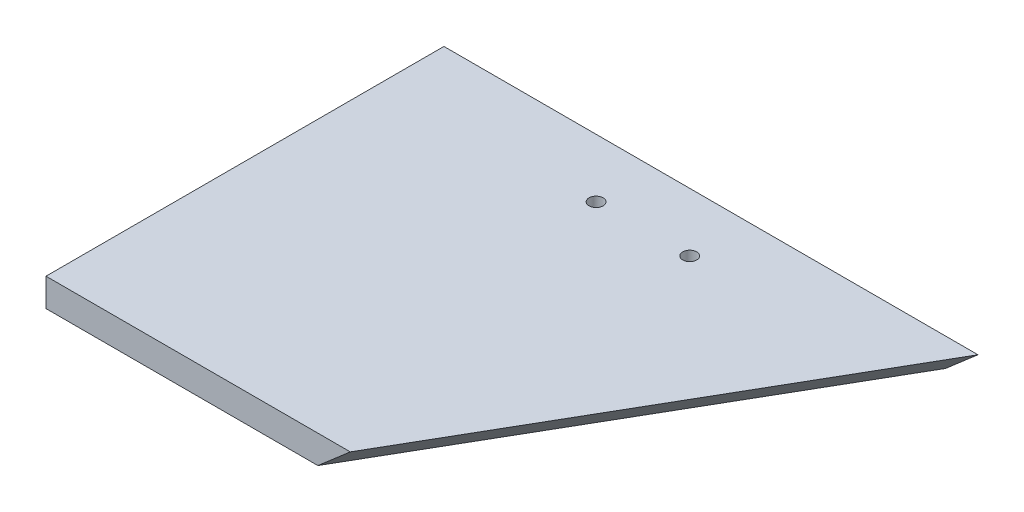
ISO-10303-21;
HEADER;
FILE_DESCRIPTION(('STEP AP214'),'2;1');
FILE_NAME('part.step','',(''),(''),'','','');
FILE_SCHEMA(('AUTOMOTIVE_DESIGN { 1 0 10303 214 1 1 1 1 }'));
ENDSEC;
DATA;
#1=APPLICATION_CONTEXT('core data for automotive mechanical design processes');
#2=APPLICATION_PROTOCOL_DEFINITION('international standard','automotive_design',2000,#1);
#3=PRODUCT_CONTEXT('',#1,'mechanical');
#4=PRODUCT('Part','Part','',(#3));
#5=PRODUCT_RELATED_PRODUCT_CATEGORY('part','',(#4));
#6=PRODUCT_DEFINITION_FORMATION('','',#4);
#7=PRODUCT_DEFINITION_CONTEXT('part definition',#1,'design');
#8=PRODUCT_DEFINITION('design','',#6,#7);
#9=PRODUCT_DEFINITION_SHAPE('','',#8);
#10=(LENGTH_UNIT() NAMED_UNIT(*) SI_UNIT(.MILLI.,.METRE.));
#11=(NAMED_UNIT(*) PLANE_ANGLE_UNIT() SI_UNIT($,.RADIAN.));
#12=(NAMED_UNIT(*) SI_UNIT($,.STERADIAN.) SOLID_ANGLE_UNIT());
#13=UNCERTAINTY_MEASURE_WITH_UNIT(LENGTH_MEASURE(1.E-05),#10,'distance_accuracy_value','');
#14=(GEOMETRIC_REPRESENTATION_CONTEXT(3) GLOBAL_UNCERTAINTY_ASSIGNED_CONTEXT((#13)) GLOBAL_UNIT_ASSIGNED_CONTEXT((#10,
#11,#12)) REPRESENTATION_CONTEXT('',''));
#15=CARTESIAN_POINT('',(0.,0.,0.));
#16=DIRECTION('',(0.,0.,1.));
#17=DIRECTION('',(1.,0.,0.));
#18=AXIS2_PLACEMENT_3D('',#15,#16,#17);
#19=CARTESIAN_POINT('',(0.,6.,0.));
#20=DIRECTION('',(0.,0.,-1.));
#21=DIRECTION('',(-1.,0.,0.));
#22=AXIS2_PLACEMENT_3D('',#19,#20,#21);
#23=PLANE('',#22);
#24=DIRECTION('',(1.,0.,0.));
#25=VECTOR('',#24,1.);
#26=CARTESIAN_POINT('',(0.,0.,0.));
#27=LINE('',#26,#25);
#28=CARTESIAN_POINT('',(-65.,0.,0.));
#29=VERTEX_POINT('',#28);
#30=CARTESIAN_POINT('',(-6.92820323027556,0.,0.));
#31=VERTEX_POINT('',#30);
#32=EDGE_CURVE('E94',#29,#31,#27,.T.);
#33=ORIENTED_EDGE('',*,*,#32,.T.);
#34=DIRECTION('',(0.755928946018456,0.654653670707976,0.));
#35=VECTOR('',#34,1.);
#36=CARTESIAN_POINT('',(0.,6.00000000000002,0.));
#37=LINE('',#36,#35);
#38=CARTESIAN_POINT('',(0.,6.,0.));
#39=VERTEX_POINT('',#38);
#40=EDGE_CURVE('E11',#31,#39,#37,.T.);
#41=ORIENTED_EDGE('',*,*,#40,.T.);
#42=DIRECTION('',(1.,0.,0.));
#43=VECTOR('',#42,1.);
#44=CARTESIAN_POINT('',(0.,6.,0.));
#45=LINE('',#44,#43);
#46=CARTESIAN_POINT('',(-65.,6.,0.));
#47=VERTEX_POINT('',#46);
#48=EDGE_CURVE('E93',#47,#39,#45,.T.);
#49=ORIENTED_EDGE('',*,*,#48,.F.);
#50=DIRECTION('',(0.,-1.,0.));
#51=VECTOR('',#50,1.);
#52=CARTESIAN_POINT('',(-65.,6.,0.));
#53=LINE('',#52,#51);
#54=EDGE_CURVE('E116',#47,#29,#53,.T.);
#55=ORIENTED_EDGE('',*,*,#54,.T.);
#56=EDGE_LOOP('',(#33,#41,#49,#55));
#57=FACE_BOUND('',#56,.T.);
#58=ADVANCED_FACE('F49',(#57),#23,.F.);
#59=CARTESIAN_POINT('',(0.,6.,-85.));
#60=DIRECTION('',(0.,0.,1.));
#61=DIRECTION('',(1.,0.,0.));
#62=AXIS2_PLACEMENT_3D('',#59,#60,#61);
#63=PLANE('',#62);
#64=DIRECTION('',(-1.,0.,0.));
#65=VECTOR('',#64,1.);
#66=CARTESIAN_POINT('',(49.0747728811187,6.,-85.));
#67=LINE('',#66,#65);
#68=CARTESIAN_POINT('',(49.0747728811187,6.,-85.));
#69=VERTEX_POINT('',#68);
#70=CARTESIAN_POINT('',(-65.,6.,-85.));
#71=VERTEX_POINT('',#70);
#72=EDGE_CURVE('E108',#69,#71,#67,.T.);
#73=ORIENTED_EDGE('',*,*,#72,.F.);
#74=DIRECTION('',(-0.755928946018456,-0.654653670707976,0.));
#75=VECTOR('',#74,1.);
#76=CARTESIAN_POINT('',(21.0320455204793,-18.2857142857145,-85.));
#77=LINE('',#76,#75);
#78=CARTESIAN_POINT('',(42.1465696508432,0.,-85.));
#79=VERTEX_POINT('',#78);
#80=EDGE_CURVE('E73',#69,#79,#77,.T.);
#81=ORIENTED_EDGE('',*,*,#80,.T.);
#82=DIRECTION('',(-1.,0.,0.));
#83=VECTOR('',#82,1.);
#84=CARTESIAN_POINT('',(0.,0.,-85.));
#85=LINE('',#84,#83);
#86=CARTESIAN_POINT('',(-65.,0.,-85.));
#87=VERTEX_POINT('',#86);
#88=EDGE_CURVE('E119',#79,#87,#85,.T.);
#89=ORIENTED_EDGE('',*,*,#88,.T.);
#90=DIRECTION('',(0.,-1.,0.));
#91=VECTOR('',#90,1.);
#92=CARTESIAN_POINT('',(-65.,6.,-85.));
#93=LINE('',#92,#91);
#94=EDGE_CURVE('E127',#71,#87,#93,.T.);
#95=ORIENTED_EDGE('',*,*,#94,.F.);
#96=EDGE_LOOP('',(#73,#81,#89,#95));
#97=FACE_BOUND('',#96,.T.);
#98=ADVANCED_FACE('F138',(#97),#63,.F.);
#99=CARTESIAN_POINT('',(-65.,6.,0.));
#100=DIRECTION('',(1.,0.,0.));
#101=DIRECTION('',(0.,0.,-1.));
#102=AXIS2_PLACEMENT_3D('',#99,#100,#101);
#103=PLANE('',#102);
#104=DIRECTION('',(0.,0.,1.));
#105=VECTOR('',#104,1.);
#106=CARTESIAN_POINT('',(-65.,0.,0.));
#107=LINE('',#106,#105);
#108=EDGE_CURVE('E105',#87,#29,#107,.T.);
#109=ORIENTED_EDGE('',*,*,#108,.T.);
#110=ORIENTED_EDGE('',*,*,#54,.F.);
#111=DIRECTION('',(0.,0.,1.));
#112=VECTOR('',#111,1.);
#113=CARTESIAN_POINT('',(-65.,6.,0.));
#114=LINE('',#113,#112);
#115=EDGE_CURVE('E102',#71,#47,#114,.T.);
#116=ORIENTED_EDGE('',*,*,#115,.F.);
#117=ORIENTED_EDGE('',*,*,#94,.T.);
#118=EDGE_LOOP('',(#109,#110,#116,#117));
#119=FACE_BOUND('',#118,.T.);
#120=ADVANCED_FACE('F136',(#119),#103,.F.);
#121=CARTESIAN_POINT('',(0.,6.,0.));
#122=DIRECTION('',(0.,-1.,0.));
#123=DIRECTION('',(0.,0.,-1.));
#124=AXIS2_PLACEMENT_3D('',#121,#122,#123);
#125=PLANE('',#124);
#126=CARTESIAN_POINT('',(-20.,6.,-72.5));
#127=DIRECTION('',(0.,1.,0.));
#128=DIRECTION('',(0.,0.,1.));
#129=AXIS2_PLACEMENT_3D('',#126,#127,#128);
#130=CIRCLE('',#129,1.5);
#131=CARTESIAN_POINT('',(-20.,6.,-71.));
#132=VERTEX_POINT('',#131);
#133=EDGE_CURVE('E168',#132,#132,#130,.T.);
#134=ORIENTED_EDGE('',*,*,#133,.F.);
#135=EDGE_LOOP('',(#134));
#136=FACE_BOUND('',#135,.T.);
#137=CARTESIAN_POINT('',(0.,6.,-72.5));
#138=DIRECTION('',(0.,1.,0.));
#139=DIRECTION('',(0.,0.,1.));
#140=AXIS2_PLACEMENT_3D('',#137,#138,#139);
#141=CIRCLE('',#140,1.5);
#142=CARTESIAN_POINT('',(0.,6.,-71.));
#143=VERTEX_POINT('',#142);
#144=EDGE_CURVE('E170',#143,#143,#141,.T.);
#145=ORIENTED_EDGE('',*,*,#144,.F.);
#146=EDGE_LOOP('',(#145));
#147=FACE_BOUND('',#146,.T.);
#148=ORIENTED_EDGE('',*,*,#48,.T.);
#149=DIRECTION('',(0.500000000000004,0.,-0.866025403784436));
#150=VECTOR('',#149,1.);
#151=CARTESIAN_POINT('',(0.,6.,0.));
#152=LINE('',#151,#150);
#153=EDGE_CURVE('E100',#39,#69,#152,.T.);
#154=ORIENTED_EDGE('',*,*,#153,.T.);
#155=ORIENTED_EDGE('',*,*,#72,.T.);
#156=ORIENTED_EDGE('',*,*,#115,.T.);
#157=EDGE_LOOP('',(#148,#154,#155,#156));
#158=FACE_BOUND('',#157,.T.);
#159=ADVANCED_FACE('F99',(#136,#147,#158),#125,.F.);
#160=CARTESIAN_POINT('',(0.,0.,0.));
#161=DIRECTION('',(0.,-1.,0.));
#162=DIRECTION('',(0.,0.,-1.));
#163=AXIS2_PLACEMENT_3D('',#160,#161,#162);
#164=PLANE('',#163);
#165=CARTESIAN_POINT('',(-20.,0.,-72.5));
#166=DIRECTION('',(0.,1.,0.));
#167=DIRECTION('',(0.,0.,1.));
#168=AXIS2_PLACEMENT_3D('',#165,#166,#167);
#169=CIRCLE('',#168,1.5);
#170=CARTESIAN_POINT('',(-20.,0.,-71.));
#171=VERTEX_POINT('',#170);
#172=EDGE_CURVE('E120',#171,#171,#169,.T.);
#173=ORIENTED_EDGE('',*,*,#172,.T.);
#174=EDGE_LOOP('',(#173));
#175=FACE_BOUND('',#174,.T.);
#176=CARTESIAN_POINT('',(0.,0.,-72.5));
#177=DIRECTION('',(0.,1.,0.));
#178=DIRECTION('',(0.,0.,1.));
#179=AXIS2_PLACEMENT_3D('',#176,#177,#178);
#180=CIRCLE('',#179,1.5);
#181=CARTESIAN_POINT('',(0.,0.,-71.));
#182=VERTEX_POINT('',#181);
#183=EDGE_CURVE('E176',#182,#182,#180,.T.);
#184=ORIENTED_EDGE('',*,*,#183,.T.);
#185=EDGE_LOOP('',(#184));
#186=FACE_BOUND('',#185,.T.);
#187=ORIENTED_EDGE('',*,*,#88,.F.);
#188=DIRECTION('',(-0.500000000000004,0.,0.866025403784436));
#189=VECTOR('',#188,1.);
#190=CARTESIAN_POINT('',(-5.19615242270664,0.,-3.00000000000004));
#191=LINE('',#190,#189);
#192=EDGE_CURVE('E59',#79,#31,#191,.T.);
#193=ORIENTED_EDGE('',*,*,#192,.T.);
#194=ORIENTED_EDGE('',*,*,#32,.F.);
#195=ORIENTED_EDGE('',*,*,#108,.F.);
#196=EDGE_LOOP('',(#187,#193,#194,#195));
#197=FACE_BOUND('',#196,.T.);
#198=ADVANCED_FACE('F137',(#175,#186,#197),#164,.T.);
#199=CARTESIAN_POINT('',(0.,0.,-72.5));
#200=DIRECTION('',(0.,1.,0.));
#201=DIRECTION('',(0.,0.,1.));
#202=AXIS2_PLACEMENT_3D('',#199,#200,#201);
#203=CYLINDRICAL_SURFACE('',#202,1.5);
#204=ORIENTED_EDGE('',*,*,#183,.F.);
#205=EDGE_LOOP('',(#204));
#206=FACE_BOUND('',#205,.T.);
#207=ORIENTED_EDGE('',*,*,#144,.T.);
#208=EDGE_LOOP('',(#207));
#209=FACE_BOUND('',#208,.T.);
#210=ADVANCED_FACE('F150',(#206,#209),#203,.F.);
#211=CARTESIAN_POINT('',(-20.,0.,-72.5));
#212=DIRECTION('',(0.,1.,0.));
#213=DIRECTION('',(0.,0.,1.));
#214=AXIS2_PLACEMENT_3D('',#211,#212,#213);
#215=CYLINDRICAL_SURFACE('',#214,1.5);
#216=ORIENTED_EDGE('',*,*,#172,.F.);
#217=EDGE_LOOP('',(#216));
#218=FACE_BOUND('',#217,.T.);
#219=ORIENTED_EDGE('',*,*,#133,.T.);
#220=EDGE_LOOP('',(#219));
#221=FACE_BOUND('',#220,.T.);
#222=ADVANCED_FACE('F156',(#218,#221),#215,.F.);
#223=CARTESIAN_POINT('',(0.,6.00000000000002,0.));
#224=DIRECTION('',(0.612372435695793,-0.707106781186548,0.353553390593276));
#225=DIRECTION('',(-0.500000000000004,0.,0.866025403784436));
#226=AXIS2_PLACEMENT_3D('',#223,#224,#225);
#227=PLANE('',#226);
#228=ORIENTED_EDGE('',*,*,#40,.F.);
#229=ORIENTED_EDGE('',*,*,#192,.F.);
#230=ORIENTED_EDGE('',*,*,#80,.F.);
#231=ORIENTED_EDGE('',*,*,#153,.F.);
#232=EDGE_LOOP('',(#228,#229,#230,#231));
#233=FACE_BOUND('',#232,.T.);
#234=ADVANCED_FACE('F52',(#233),#227,.T.);
#235=CLOSED_SHELL('',(#58,#98,#120,#159,#198,#210,#222,#234));
#236=MANIFOLD_SOLID_BREP('B2',#235);
#237=ADVANCED_BREP_SHAPE_REPRESENTATION('',(#18,#236),#14);
#238=SHAPE_DEFINITION_REPRESENTATION(#9,#237);
ENDSEC;
END-ISO-10303-21;
